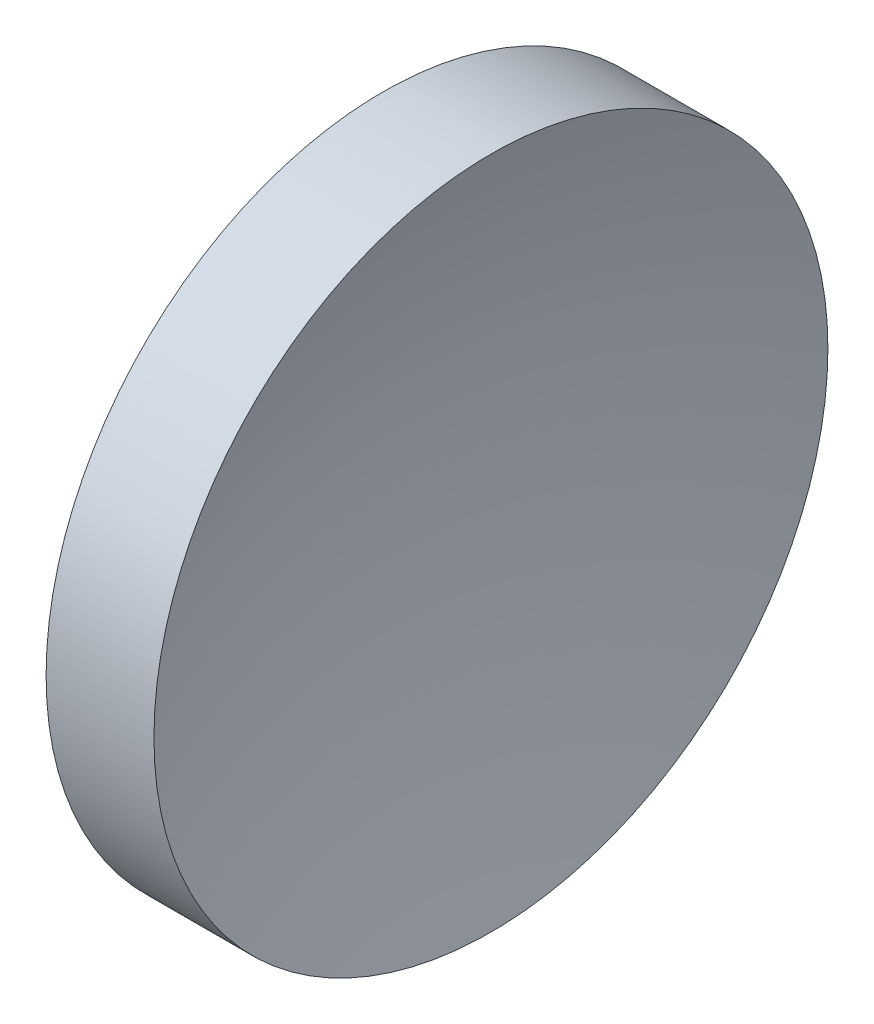
ISO-10303-21;
HEADER;
FILE_DESCRIPTION(('STEP AP214'),'2;1');
FILE_NAME('part.step','',(''),(''),'','','');
FILE_SCHEMA(('AUTOMOTIVE_DESIGN { 1 0 10303 214 1 1 1 1 }'));
ENDSEC;
DATA;
#1=APPLICATION_CONTEXT('core data for automotive mechanical design processes');
#2=APPLICATION_PROTOCOL_DEFINITION('international standard','automotive_design',2000,#1);
#3=PRODUCT_CONTEXT('',#1,'mechanical');
#4=PRODUCT('Part','Part','',(#3));
#5=PRODUCT_RELATED_PRODUCT_CATEGORY('part','',(#4));
#6=PRODUCT_DEFINITION_FORMATION('','',#4);
#7=PRODUCT_DEFINITION_CONTEXT('part definition',#1,'design');
#8=PRODUCT_DEFINITION('design','',#6,#7);
#9=PRODUCT_DEFINITION_SHAPE('','',#8);
#10=(LENGTH_UNIT() NAMED_UNIT(*) SI_UNIT(.MILLI.,.METRE.));
#11=(NAMED_UNIT(*) PLANE_ANGLE_UNIT() SI_UNIT($,.RADIAN.));
#12=(NAMED_UNIT(*) SI_UNIT($,.STERADIAN.) SOLID_ANGLE_UNIT());
#13=UNCERTAINTY_MEASURE_WITH_UNIT(LENGTH_MEASURE(1.E-05),#10,'distance_accuracy_value','');
#14=(GEOMETRIC_REPRESENTATION_CONTEXT(3) GLOBAL_UNCERTAINTY_ASSIGNED_CONTEXT((#13)) GLOBAL_UNIT_ASSIGNED_CONTEXT((#10,
#11,#12)) REPRESENTATION_CONTEXT('',''));
#15=CARTESIAN_POINT('',(0.,0.,0.));
#16=DIRECTION('',(0.,0.,1.));
#17=DIRECTION('',(1.,0.,0.));
#18=AXIS2_PLACEMENT_3D('',#15,#16,#17);
#19=CARTESIAN_POINT('',(41.9967103839267,0.,0.));
#20=DIRECTION('',(1.,0.,0.));
#21=DIRECTION('',(0.,0.,1.));
#22=AXIS2_PLACEMENT_3D('',#19,#20,#21);
#23=SPHERICAL_SURFACE('',#22,40.);
#24=CARTESIAN_POINT('',(4.,0.,0.));
#25=DIRECTION('',(1.,0.,0.));
#26=DIRECTION('',(0.,0.,-1.));
#27=AXIS2_PLACEMENT_3D('',#24,#25,#26);
#28=CIRCLE('',#27,12.5);
#29=CARTESIAN_POINT('',(4.,0.,-12.5));
#30=VERTEX_POINT('',#29);
#31=EDGE_CURVE('E10',#30,#30,#28,.T.);
#32=ORIENTED_EDGE('',*,*,#31,.T.);
#33=EDGE_LOOP('',(#32));
#34=FACE_BOUND('',#33,.T.);
#35=ADVANCED_FACE('F30',(#34),#23,.F.);
#36=CARTESIAN_POINT('',(1.99671038392666,0.,0.));
#37=DIRECTION('',(1.,0.,0.));
#38=DIRECTION('',(0.,0.,-1.));
#39=AXIS2_PLACEMENT_3D('',#36,#37,#38);
#40=CYLINDRICAL_SURFACE('',#39,12.5);
#41=ORIENTED_EDGE('',*,*,#31,.F.);
#42=EDGE_LOOP('',(#41));
#43=FACE_BOUND('',#42,.T.);
#44=CARTESIAN_POINT('',(0.,0.,0.));
#45=DIRECTION('',(1.,0.,0.));
#46=DIRECTION('',(0.,0.,-1.));
#47=AXIS2_PLACEMENT_3D('',#44,#45,#46);
#48=CIRCLE('',#47,12.5);
#49=CARTESIAN_POINT('',(0.,0.,-12.5));
#50=VERTEX_POINT('',#49);
#51=EDGE_CURVE('E36',#50,#50,#48,.T.);
#52=ORIENTED_EDGE('',*,*,#51,.T.);
#53=EDGE_LOOP('',(#52));
#54=FACE_BOUND('',#53,.T.);
#55=ADVANCED_FACE('F42',(#43,#54),#40,.T.);
#56=CARTESIAN_POINT('',(149.478259288767,0.,0.));
#57=DIRECTION('',(1.,0.,0.));
#58=DIRECTION('',(0.,0.,-1.));
#59=AXIS2_PLACEMENT_3D('',#56,#57,#58);
#60=SPHERICAL_SURFACE('',#59,150.);
#61=ORIENTED_EDGE('',*,*,#51,.F.);
#62=EDGE_LOOP('',(#61));
#63=FACE_BOUND('',#62,.T.);
#64=ADVANCED_FACE('F44',(#63),#60,.T.);
#65=CLOSED_SHELL('',(#35,#55,#64));
#66=MANIFOLD_SOLID_BREP('B2',#65);
#67=ADVANCED_BREP_SHAPE_REPRESENTATION('',(#18,#66),#14);
#68=SHAPE_DEFINITION_REPRESENTATION(#9,#67);
ENDSEC;
END-ISO-10303-21;
